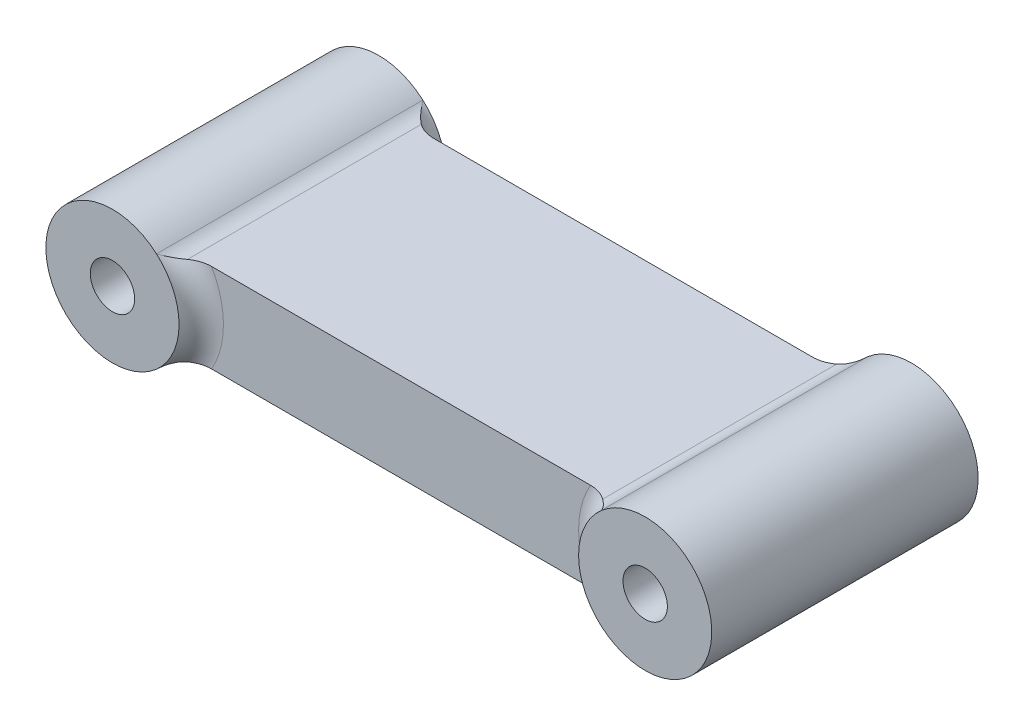
ISO-10303-21;
HEADER;
FILE_DESCRIPTION(('STEP AP214'),'2;1');
FILE_NAME('part.step','',(''),(''),'','','');
FILE_SCHEMA(('AUTOMOTIVE_DESIGN { 1 0 10303 214 1 1 1 1 }'));
ENDSEC;
DATA;
#1=APPLICATION_CONTEXT('core data for automotive mechanical design processes');
#2=APPLICATION_PROTOCOL_DEFINITION('international standard','automotive_design',2000,#1);
#3=PRODUCT_CONTEXT('',#1,'mechanical');
#4=PRODUCT('Part','Part','',(#3));
#5=PRODUCT_RELATED_PRODUCT_CATEGORY('part','',(#4));
#6=PRODUCT_DEFINITION_FORMATION('','',#4);
#7=PRODUCT_DEFINITION_CONTEXT('part definition',#1,'design');
#8=PRODUCT_DEFINITION('design','',#6,#7);
#9=PRODUCT_DEFINITION_SHAPE('','',#8);
#10=(LENGTH_UNIT() NAMED_UNIT(*) SI_UNIT(.MILLI.,.METRE.));
#11=(NAMED_UNIT(*) PLANE_ANGLE_UNIT() SI_UNIT($,.RADIAN.));
#12=(NAMED_UNIT(*) SI_UNIT($,.STERADIAN.) SOLID_ANGLE_UNIT());
#13=UNCERTAINTY_MEASURE_WITH_UNIT(LENGTH_MEASURE(1.E-05),#10,'distance_accuracy_value','');
#14=(GEOMETRIC_REPRESENTATION_CONTEXT(3) GLOBAL_UNCERTAINTY_ASSIGNED_CONTEXT((#13)) GLOBAL_UNIT_ASSIGNED_CONTEXT((#10,
#11,#12)) REPRESENTATION_CONTEXT('',''));
#15=CARTESIAN_POINT('',(0.,0.,0.));
#16=DIRECTION('',(0.,0.,1.));
#17=DIRECTION('',(1.,0.,0.));
#18=AXIS2_PLACEMENT_3D('',#15,#16,#17);
#19=CARTESIAN_POINT('',(23.,-2.,5.));
#20=DIRECTION('',(0.,1.,0.));
#21=DIRECTION('',(0.,0.,1.));
#22=AXIS2_PLACEMENT_3D('',#19,#20,#21);
#23=PLANE('',#22);
#24=DIRECTION('',(1.,0.,0.));
#25=VECTOR('',#24,1.);
#26=CARTESIAN_POINT('',(23.,-2.,-5.));
#27=LINE('',#26,#25);
#28=CARTESIAN_POINT('',(3.46410161513775,-2.,-5.));
#29=VERTEX_POINT('',#28);
#30=CARTESIAN_POINT('',(20.5358983848623,-2.,-5.));
#31=VERTEX_POINT('',#30);
#32=EDGE_CURVE('E162',#29,#31,#27,.T.);
#33=ORIENTED_EDGE('',*,*,#32,.T.);
#34=CARTESIAN_POINT('',(20.5358983848623,-2.,-5.));
#35=CARTESIAN_POINT('',(20.6224491273589,-2.,-5.00000546800803));
#36=CARTESIAN_POINT('',(20.7089389296264,-2.,-5.00842702045414));
#37=CARTESIAN_POINT('',(20.876455217603,-2.,-5.04066814521653));
#38=CARTESIAN_POINT('',(20.9575671155496,-2.,-5.06404323747672));
#39=CARTESIAN_POINT('',(21.0919763731926,-2.,-5.11623692688967));
#40=CARTESIAN_POINT('',(21.1466292215736,-2.,-5.14162250615181));
#41=CARTESIAN_POINT('',(21.2531753944758,-2.,-5.20002912144058));
#42=CARTESIAN_POINT('',(21.3049871669762,-2.,-5.23319865643572));
#43=CARTESIAN_POINT('',(21.3542486889354,-2.,-5.26993265869291));
#44=B_SPLINE_CURVE_WITH_KNOTS('',3,(#34,#35,#36,#37,#38,#39,#40,#41,#42,#43),.UNSPECIFIED.,.F.,
.F.,(4,2,2,2,4),(0.,0.259193483634548,0.511019606520545,0.69130396172624,0.875356440862325),.UNSPECIFIED.);
#45=CARTESIAN_POINT('',(21.3542486889354,-2.,-5.26993265869291));
#46=VERTEX_POINT('',#45);
#47=EDGE_CURVE('E311',#31,#46,#44,.T.);
#48=ORIENTED_EDGE('',*,*,#47,.T.);
#49=DIRECTION('',(0.,0.,1.));
#50=VECTOR('',#49,1.);
#51=CARTESIAN_POINT('',(21.3542486889354,-2.,5.));
#52=LINE('',#51,#50);
#53=CARTESIAN_POINT('',(21.3542486889354,-2.,5.26993265869291));
#54=VERTEX_POINT('',#53);
#55=EDGE_CURVE('E195',#46,#54,#52,.T.);
#56=ORIENTED_EDGE('',*,*,#55,.T.);
#57=CARTESIAN_POINT('',(21.3542486889354,-2.,5.26993265869291));
#58=CARTESIAN_POINT('',(21.3195104777886,-2.,5.24401132146456));
#59=CARTESIAN_POINT('',(21.2834971833119,-2.,5.2198749810097));
#60=CARTESIAN_POINT('',(21.2093014088683,-2.,5.17522551429657));
#61=CARTESIAN_POINT('',(21.1711195347141,-2.,5.15471138265658));
#62=CARTESIAN_POINT('',(21.0561591308194,-2.,5.09975997145693));
#63=CARTESIAN_POINT('',(20.976878090308,-2.,5.07039153665916));
#64=CARTESIAN_POINT('',(20.8377024129543,-2.,5.03261806093048));
#65=CARTESIAN_POINT('',(20.7787429213188,-2.,5.0206205481441));
#66=CARTESIAN_POINT('',(20.6585290915753,-2.,5.00423581430545));
#67=CARTESIAN_POINT('',(20.5972525292827,-2.,5.00001209782037));
#68=CARTESIAN_POINT('',(20.5358983848623,-2.,5.));
#69=B_SPLINE_CURVE_WITH_KNOTS('',3,(#57,#58,#59,#60,#61,#62,#63,#64,#65,#66,#67,#68),
.UNSPECIFIED.,.F.,.F.,(4,2,2,2,2,4),(0.,0.129893289692775,0.25975046928371,0.511832988699556,
0.69187057715927,0.875653389153103),.UNSPECIFIED.);
#70=CARTESIAN_POINT('',(20.5358983848623,-2.,5.));
#71=VERTEX_POINT('',#70);
#72=EDGE_CURVE('E310',#54,#71,#69,.T.);
#73=ORIENTED_EDGE('',*,*,#72,.T.);
#74=DIRECTION('',(1.,0.,0.));
#75=VECTOR('',#74,1.);
#76=CARTESIAN_POINT('',(23.,-2.,5.));
#77=LINE('',#76,#75);
#78=CARTESIAN_POINT('',(3.46410161513775,-2.,5.));
#79=VERTEX_POINT('',#78);
#80=EDGE_CURVE('E171',#79,#71,#77,.T.);
#81=ORIENTED_EDGE('',*,*,#80,.F.);
#82=CARTESIAN_POINT('',(3.46410161513775,-2.,5.));
#83=CARTESIAN_POINT('',(3.3775508726411,-2.,5.00000546800803));
#84=CARTESIAN_POINT('',(3.2910610703736,-2.,5.00842702045414));
#85=CARTESIAN_POINT('',(3.12354478239697,-2.,5.04066814521653));
#86=CARTESIAN_POINT('',(3.04243288445038,-2.,5.06404323747671));
#87=CARTESIAN_POINT('',(2.90802362680743,-2.,5.11623692688967));
#88=CARTESIAN_POINT('',(2.85337077842639,-2.,5.14162250615181));
#89=CARTESIAN_POINT('',(2.74682460552416,-2.,5.20002912144058));
#90=CARTESIAN_POINT('',(2.69501283302383,-2.,5.23319865643571));
#91=CARTESIAN_POINT('',(2.64575131106459,-2.,5.26993265869291));
#92=B_SPLINE_CURVE_WITH_KNOTS('',3,(#82,#83,#84,#85,#86,#87,#88,#89,#90,#91),.UNSPECIFIED.,.F.,
.F.,(4,2,2,2,4),(0.,0.259193483634546,0.511019606520545,0.691303961726233,0.875356440862324),.UNSPECIFIED.);
#93=CARTESIAN_POINT('',(2.64575131106459,-2.,5.26993265869291));
#94=VERTEX_POINT('',#93);
#95=EDGE_CURVE('E49',#79,#94,#92,.T.);
#96=ORIENTED_EDGE('',*,*,#95,.T.);
#97=DIRECTION('',(0.,0.,1.));
#98=VECTOR('',#97,1.);
#99=CARTESIAN_POINT('',(2.64575131106459,-2.,-5.));
#100=LINE('',#99,#98);
#101=CARTESIAN_POINT('',(2.64575131106459,-2.,-5.26993265869291));
#102=VERTEX_POINT('',#101);
#103=EDGE_CURVE('E193',#94,#102,#100,.F.);
#104=ORIENTED_EDGE('',*,*,#103,.T.);
#105=CARTESIAN_POINT('',(2.64575131106459,-2.,-5.26993265869291));
#106=CARTESIAN_POINT('',(2.68048952221139,-2.,-5.24401132146456));
#107=CARTESIAN_POINT('',(2.71650281668806,-2.,-5.2198749810097));
#108=CARTESIAN_POINT('',(2.79069859113175,-2.,-5.17522551429657));
#109=CARTESIAN_POINT('',(2.82888046528587,-2.,-5.15471138265658));
#110=CARTESIAN_POINT('',(2.94384086918057,-2.,-5.09975997145693));
#111=CARTESIAN_POINT('',(3.02312190969201,-2.,-5.07039153665916));
#112=CARTESIAN_POINT('',(3.16229758704567,-2.,-5.03261806093048));
#113=CARTESIAN_POINT('',(3.22125707868117,-2.,-5.0206205481441));
#114=CARTESIAN_POINT('',(3.34147090842471,-2.,-5.00423581430545));
#115=CARTESIAN_POINT('',(3.40274747071726,-2.,-5.00001209782038));
#116=CARTESIAN_POINT('',(3.46410161513775,-2.,-5.));
#117=B_SPLINE_CURVE_WITH_KNOTS('',3,(#105,#106,#107,#108,#109,#110,#111,#112,#113,#114,#115,
#116),.UNSPECIFIED.,.F.,.F.,(4,2,2,2,2,4),(0.,0.129893289692774,0.259750469283706,
0.511832988699554,0.691870577159268,0.875653389153102),.UNSPECIFIED.);
#118=EDGE_CURVE('E213',#102,#29,#117,.T.);
#119=ORIENTED_EDGE('',*,*,#118,.T.);
#120=EDGE_LOOP('',(#33,#48,#56,#73,#81,#96,#104,#119));
#121=FACE_BOUND('',#120,.T.);
#122=ADVANCED_FACE('F35',(#121),#23,.F.);
#123=CARTESIAN_POINT('',(2.23606797749979,2.,5.));
#124=DIRECTION('',(0.,-1.,0.));
#125=DIRECTION('',(0.,0.,-1.));
#126=AXIS2_PLACEMENT_3D('',#123,#124,#125);
#127=PLANE('',#126);
#128=CARTESIAN_POINT('',(3.46410161513775,2.,-5.));
#129=CARTESIAN_POINT('',(3.3775508726411,2.,-5.00000546800803));
#130=CARTESIAN_POINT('',(3.2910610703736,2.,-5.00842702045414));
#131=CARTESIAN_POINT('',(3.12354478239697,2.,-5.04066814521653));
#132=CARTESIAN_POINT('',(3.04243288445038,2.,-5.06404323747671));
#133=CARTESIAN_POINT('',(2.90802362680743,2.,-5.11623692688967));
#134=CARTESIAN_POINT('',(2.85337077842639,2.,-5.14162250615181));
#135=CARTESIAN_POINT('',(2.74682460552416,2.,-5.20002912144058));
#136=CARTESIAN_POINT('',(2.69501283302383,2.,-5.23319865643571));
#137=CARTESIAN_POINT('',(2.64575131106459,2.,-5.26993265869291));
#138=B_SPLINE_CURVE_WITH_KNOTS('',3,(#128,#129,#130,#131,#132,#133,#134,#135,#136,#137),
.UNSPECIFIED.,.F.,.F.,(4,2,2,2,4),(0.,0.259193483634546,0.511019606520545,0.691303961726233,
0.875356440862324),.UNSPECIFIED.);
#139=CARTESIAN_POINT('',(3.46410161513775,2.,-5.));
#140=VERTEX_POINT('',#139);
#141=CARTESIAN_POINT('',(2.64575131106459,2.,-5.26993265869291));
#142=VERTEX_POINT('',#141);
#143=EDGE_CURVE('E221',#140,#142,#138,.T.);
#144=ORIENTED_EDGE('',*,*,#143,.T.);
#145=DIRECTION('',(0.,0.,1.));
#146=VECTOR('',#145,1.);
#147=CARTESIAN_POINT('',(2.64575131106459,2.,5.));
#148=LINE('',#147,#146);
#149=CARTESIAN_POINT('',(2.64575131106459,2.,5.26993265869291));
#150=VERTEX_POINT('',#149);
#151=EDGE_CURVE('E207',#142,#150,#148,.T.);
#152=ORIENTED_EDGE('',*,*,#151,.T.);
#153=CARTESIAN_POINT('',(2.64575131106459,2.,5.26993265869291));
#154=CARTESIAN_POINT('',(2.68048952221139,2.,5.24401132146456));
#155=CARTESIAN_POINT('',(2.71650281668806,2.,5.2198749810097));
#156=CARTESIAN_POINT('',(2.79069859113175,2.,5.17522551429657));
#157=CARTESIAN_POINT('',(2.82888046528587,2.,5.15471138265658));
#158=CARTESIAN_POINT('',(2.94384086918057,2.,5.09975997145693));
#159=CARTESIAN_POINT('',(3.02312190969201,2.,5.07039153665916));
#160=CARTESIAN_POINT('',(3.16229758704567,2.,5.03261806093048));
#161=CARTESIAN_POINT('',(3.22125707868117,2.,5.0206205481441));
#162=CARTESIAN_POINT('',(3.34147090842471,2.,5.00423581430545));
#163=CARTESIAN_POINT('',(3.40274747071726,2.,5.00001209782038));
#164=CARTESIAN_POINT('',(3.46410161513776,2.,5.));
#165=B_SPLINE_CURVE_WITH_KNOTS('',3,(#153,#154,#155,#156,#157,#158,#159,#160,#161,#162,#163,
#164),.UNSPECIFIED.,.F.,.F.,(4,2,2,2,2,4),(0.,0.129893289692774,0.259750469283706,
0.511832988699554,0.691870577159268,0.875653389153103),.UNSPECIFIED.);
#166=CARTESIAN_POINT('',(3.46410161513776,2.,5.));
#167=VERTEX_POINT('',#166);
#168=EDGE_CURVE('E11',#150,#167,#165,.T.);
#169=ORIENTED_EDGE('',*,*,#168,.T.);
#170=DIRECTION('',(-1.,0.,0.));
#171=VECTOR('',#170,1.);
#172=CARTESIAN_POINT('',(2.23606797749979,2.,5.));
#173=LINE('',#172,#171);
#174=CARTESIAN_POINT('',(20.5358983848623,2.,5.));
#175=VERTEX_POINT('',#174);
#176=EDGE_CURVE('E174',#175,#167,#173,.T.);
#177=ORIENTED_EDGE('',*,*,#176,.F.);
#178=CARTESIAN_POINT('',(20.5358983848623,2.,5.));
#179=CARTESIAN_POINT('',(20.6224491273589,2.,5.00000546800803));
#180=CARTESIAN_POINT('',(20.7089389296264,2.,5.00842702045414));
#181=CARTESIAN_POINT('',(20.876455217603,2.,5.04066814521653));
#182=CARTESIAN_POINT('',(20.9575671155496,2.,5.06404323747672));
#183=CARTESIAN_POINT('',(21.0919763731926,2.,5.11623692688967));
#184=CARTESIAN_POINT('',(21.1466292215736,2.,5.14162250615181));
#185=CARTESIAN_POINT('',(21.2531753944758,2.,5.20002912144058));
#186=CARTESIAN_POINT('',(21.3049871669762,2.,5.23319865643572));
#187=CARTESIAN_POINT('',(21.3542486889354,2.,5.26993265869291));
#188=B_SPLINE_CURVE_WITH_KNOTS('',3,(#178,#179,#180,#181,#182,#183,#184,#185,#186,#187),
.UNSPECIFIED.,.F.,.F.,(4,2,2,2,4),(0.,0.259193483634548,0.511019606520545,0.69130396172624,
0.875356440862325),.UNSPECIFIED.);
#189=CARTESIAN_POINT('',(21.3542486889354,2.,5.26993265869291));
#190=VERTEX_POINT('',#189);
#191=EDGE_CURVE('E275',#175,#190,#188,.T.);
#192=ORIENTED_EDGE('',*,*,#191,.T.);
#193=DIRECTION('',(0.,0.,1.));
#194=VECTOR('',#193,1.);
#195=CARTESIAN_POINT('',(21.3542486889354,2.,-5.));
#196=LINE('',#195,#194);
#197=CARTESIAN_POINT('',(21.3542486889354,2.,-5.26993265869291));
#198=VERTEX_POINT('',#197);
#199=EDGE_CURVE('E57',#190,#198,#196,.F.);
#200=ORIENTED_EDGE('',*,*,#199,.T.);
#201=CARTESIAN_POINT('',(21.3542486889354,2.,-5.26993265869291));
#202=CARTESIAN_POINT('',(21.3195104777886,2.,-5.24401132146456));
#203=CARTESIAN_POINT('',(21.2834971833119,2.,-5.2198749810097));
#204=CARTESIAN_POINT('',(21.2093014088683,2.,-5.17522551429657));
#205=CARTESIAN_POINT('',(21.1711195347141,2.,-5.15471138265658));
#206=CARTESIAN_POINT('',(21.0561591308194,2.,-5.09975997145693));
#207=CARTESIAN_POINT('',(20.976878090308,2.,-5.07039153665916));
#208=CARTESIAN_POINT('',(20.8377024129543,2.,-5.03261806093048));
#209=CARTESIAN_POINT('',(20.7787429213188,2.,-5.0206205481441));
#210=CARTESIAN_POINT('',(20.6585290915753,2.,-5.00423581430545));
#211=CARTESIAN_POINT('',(20.5972525292827,2.,-5.00001209782037));
#212=CARTESIAN_POINT('',(20.5358983848623,2.,-5.));
#213=B_SPLINE_CURVE_WITH_KNOTS('',3,(#201,#202,#203,#204,#205,#206,#207,#208,#209,#210,#211,
#212),.UNSPECIFIED.,.F.,.F.,(4,2,2,2,2,4),(0.,0.129893289692775,0.25975046928371,
0.511832988699556,0.69187057715927,0.875653389153103),.UNSPECIFIED.);
#214=CARTESIAN_POINT('',(20.5358983848623,2.,-5.));
#215=VERTEX_POINT('',#214);
#216=EDGE_CURVE('E305',#198,#215,#213,.T.);
#217=ORIENTED_EDGE('',*,*,#216,.T.);
#218=DIRECTION('',(-1.,0.,0.));
#219=VECTOR('',#218,1.);
#220=CARTESIAN_POINT('',(2.23606797749979,2.,-5.));
#221=LINE('',#220,#219);
#222=EDGE_CURVE('E164',#215,#140,#221,.T.);
#223=ORIENTED_EDGE('',*,*,#222,.T.);
#224=EDGE_LOOP('',(#144,#152,#169,#177,#192,#200,#217,#223));
#225=FACE_BOUND('',#224,.T.);
#226=ADVANCED_FACE('F294',(#225),#127,.F.);
#227=CARTESIAN_POINT('',(0.,0.,6.));
#228=DIRECTION('',(0.,0.,-1.));
#229=DIRECTION('',(-1.,0.,0.));
#230=AXIS2_PLACEMENT_3D('',#227,#228,#229);
#231=CYLINDRICAL_SURFACE('',#230,3.);
#232=CARTESIAN_POINT('',(0.,0.,-6.));
#233=DIRECTION('',(0.,0.,1.));
#234=DIRECTION('',(1.,0.,0.));
#235=AXIS2_PLACEMENT_3D('',#232,#233,#234);
#236=CIRCLE('',#235,3.);
#237=CARTESIAN_POINT('',(1.98431348329844,2.25,-6.));
#238=VERTEX_POINT('',#237);
#239=CARTESIAN_POINT('',(1.98431348329844,-2.25,-6.));
#240=VERTEX_POINT('',#239);
#241=EDGE_CURVE('E189',#238,#240,#236,.T.);
#242=ORIENTED_EDGE('',*,*,#241,.T.);
#243=DIRECTION('',(0.,0.,-1.));
#244=VECTOR('',#243,1.);
#245=CARTESIAN_POINT('',(1.98431348329844,-2.25,6.));
#246=LINE('',#245,#244);
#247=CARTESIAN_POINT('',(1.98431348329844,-2.25,6.));
#248=VERTEX_POINT('',#247);
#249=EDGE_CURVE('E199',#240,#248,#246,.F.);
#250=ORIENTED_EDGE('',*,*,#249,.T.);
#251=CARTESIAN_POINT('',(0.,0.,6.));
#252=DIRECTION('',(0.,0.,1.));
#253=DIRECTION('',(1.,0.,0.));
#254=AXIS2_PLACEMENT_3D('',#251,#252,#253);
#255=CIRCLE('',#254,3.);
#256=CARTESIAN_POINT('',(1.98431348329844,2.25,6.));
#257=VERTEX_POINT('',#256);
#258=EDGE_CURVE('E138',#257,#248,#255,.T.);
#259=ORIENTED_EDGE('',*,*,#258,.F.);
#260=DIRECTION('',(0.,0.,-1.));
#261=VECTOR('',#260,1.);
#262=CARTESIAN_POINT('',(1.98431348329844,2.25,6.));
#263=LINE('',#262,#261);
#264=EDGE_CURVE('E197',#257,#238,#263,.T.);
#265=ORIENTED_EDGE('',*,*,#264,.T.);
#266=EDGE_LOOP('',(#242,#250,#259,#265));
#267=FACE_BOUND('',#266,.T.);
#268=ADVANCED_FACE('F298',(#267),#231,.T.);
#269=CARTESIAN_POINT('',(0.,0.,6.));
#270=DIRECTION('',(0.,0.,1.));
#271=DIRECTION('',(1.,0.,0.));
#272=AXIS2_PLACEMENT_3D('',#269,#270,#271);
#273=PLANE('',#272);
#274=ORIENTED_EDGE('',*,*,#258,.T.);
#275=EDGE_CURVE('E188',#248,#257,#255,.T.);
#276=ORIENTED_EDGE('',*,*,#275,.T.);
#277=EDGE_LOOP('',(#274,#276));
#278=FACE_BOUND('',#277,.T.);
#279=CARTESIAN_POINT('',(0.,0.,6.));
#280=DIRECTION('',(0.,0.,1.));
#281=DIRECTION('',(1.,0.,0.));
#282=AXIS2_PLACEMENT_3D('',#279,#280,#281);
#283=CIRCLE('',#282,1.);
#284=CARTESIAN_POINT('',(1.,0.,6.));
#285=VERTEX_POINT('',#284);
#286=EDGE_CURVE('E180',#285,#285,#283,.T.);
#287=ORIENTED_EDGE('',*,*,#286,.F.);
#288=EDGE_LOOP('',(#287));
#289=FACE_BOUND('',#288,.T.);
#290=ADVANCED_FACE('F371',(#278,#289),#273,.T.);
#291=CARTESIAN_POINT('',(0.,0.,-6.));
#292=DIRECTION('',(0.,0.,1.));
#293=DIRECTION('',(1.,0.,0.));
#294=AXIS2_PLACEMENT_3D('',#291,#292,#293);
#295=PLANE('',#294);
#296=ORIENTED_EDGE('',*,*,#241,.F.);
#297=EDGE_CURVE('E183',#240,#238,#236,.T.);
#298=ORIENTED_EDGE('',*,*,#297,.F.);
#299=EDGE_LOOP('',(#296,#298));
#300=FACE_BOUND('',#299,.T.);
#301=CARTESIAN_POINT('',(0.,0.,-6.));
#302=DIRECTION('',(0.,0.,1.));
#303=DIRECTION('',(1.,0.,0.));
#304=AXIS2_PLACEMENT_3D('',#301,#302,#303);
#305=CIRCLE('',#304,1.);
#306=CARTESIAN_POINT('',(1.,0.,-6.));
#307=VERTEX_POINT('',#306);
#308=EDGE_CURVE('E176',#307,#307,#305,.T.);
#309=ORIENTED_EDGE('',*,*,#308,.T.);
#310=EDGE_LOOP('',(#309));
#311=FACE_BOUND('',#310,.T.);
#312=ADVANCED_FACE('F362',(#300,#311),#295,.F.);
#313=CARTESIAN_POINT('',(0.,0.,6.));
#314=DIRECTION('',(0.,0.,-1.));
#315=DIRECTION('',(-1.,0.,0.));
#316=AXIS2_PLACEMENT_3D('',#313,#314,#315);
#317=CYLINDRICAL_SURFACE('',#316,1.);
#318=ORIENTED_EDGE('',*,*,#286,.T.);
#319=EDGE_LOOP('',(#318));
#320=FACE_BOUND('',#319,.T.);
#321=ORIENTED_EDGE('',*,*,#308,.F.);
#322=EDGE_LOOP('',(#321));
#323=FACE_BOUND('',#322,.T.);
#324=ADVANCED_FACE('F377',(#320,#323),#317,.F.);
#325=CARTESIAN_POINT('',(0.,0.,5.));
#326=DIRECTION('',(0.,0.,-1.));
#327=DIRECTION('',(-1.,0.,0.));
#328=AXIS2_PLACEMENT_3D('',#325,#326,#327);
#329=PLANE('',#328);
#330=ORIENTED_EDGE('',*,*,#80,.T.);
#331=CARTESIAN_POINT('',(24.,0.,5.));
#332=DIRECTION('',(0.,0.,-1.));
#333=DIRECTION('',(-1.,0.,0.));
#334=AXIS2_PLACEMENT_3D('',#331,#332,#333);
#335=CIRCLE('',#334,3.99999999999999);
#336=EDGE_CURVE('E211',#71,#175,#335,.T.);
#337=ORIENTED_EDGE('',*,*,#336,.T.);
#338=ORIENTED_EDGE('',*,*,#176,.T.);
#339=CARTESIAN_POINT('',(0.,0.,5.));
#340=DIRECTION('',(0.,0.,-1.));
#341=DIRECTION('',(-1.,0.,0.));
#342=AXIS2_PLACEMENT_3D('',#339,#340,#341);
#343=CIRCLE('',#342,4.);
#344=EDGE_CURVE('E209',#167,#79,#343,.T.);
#345=ORIENTED_EDGE('',*,*,#344,.T.);
#346=EDGE_LOOP('',(#330,#337,#338,#345));
#347=FACE_BOUND('',#346,.T.);
#348=ADVANCED_FACE('F380',(#347),#329,.F.);
#349=CARTESIAN_POINT('',(0.,0.,-5.));
#350=DIRECTION('',(0.,0.,-1.));
#351=DIRECTION('',(-1.,0.,0.));
#352=AXIS2_PLACEMENT_3D('',#349,#350,#351);
#353=PLANE('',#352);
#354=ORIENTED_EDGE('',*,*,#32,.F.);
#355=CARTESIAN_POINT('',(0.,0.,-5.));
#356=DIRECTION('',(0.,0.,-1.));
#357=DIRECTION('',(-1.,0.,0.));
#358=AXIS2_PLACEMENT_3D('',#355,#356,#357);
#359=CIRCLE('',#358,4.);
#360=EDGE_CURVE('E204',#29,#140,#359,.F.);
#361=ORIENTED_EDGE('',*,*,#360,.T.);
#362=ORIENTED_EDGE('',*,*,#222,.F.);
#363=CARTESIAN_POINT('',(24.,0.,-5.));
#364=DIRECTION('',(0.,0.,-1.));
#365=DIRECTION('',(-1.,0.,0.));
#366=AXIS2_PLACEMENT_3D('',#363,#364,#365);
#367=CIRCLE('',#366,3.99999999999999);
#368=EDGE_CURVE('E202',#215,#31,#367,.F.);
#369=ORIENTED_EDGE('',*,*,#368,.T.);
#370=EDGE_LOOP('',(#354,#361,#362,#369));
#371=FACE_BOUND('',#370,.T.);
#372=ADVANCED_FACE('F299',(#371),#353,.T.);
#373=CARTESIAN_POINT('',(24.,0.,6.));
#374=DIRECTION('',(0.,0.,-1.));
#375=DIRECTION('',(-1.,0.,0.));
#376=AXIS2_PLACEMENT_3D('',#373,#374,#375);
#377=CYLINDRICAL_SURFACE('',#376,2.99999999999999);
#378=CARTESIAN_POINT('',(24.,0.,6.));
#379=DIRECTION('',(0.,0.,1.));
#380=DIRECTION('',(1.,0.,0.));
#381=AXIS2_PLACEMENT_3D('',#378,#379,#380);
#382=CIRCLE('',#381,2.99999999999999);
#383=CARTESIAN_POINT('',(22.0156865167016,-2.25,6.));
#384=VERTEX_POINT('',#383);
#385=CARTESIAN_POINT('',(22.0156865167016,2.25,6.));
#386=VERTEX_POINT('',#385);
#387=EDGE_CURVE('E131',#384,#386,#382,.T.);
#388=ORIENTED_EDGE('',*,*,#387,.F.);
#389=DIRECTION('',(0.,0.,-1.));
#390=VECTOR('',#389,1.);
#391=CARTESIAN_POINT('',(22.0156865167016,-2.25,6.));
#392=LINE('',#391,#390);
#393=CARTESIAN_POINT('',(22.0156865167016,-2.25,-6.));
#394=VERTEX_POINT('',#393);
#395=EDGE_CURVE('E137',#384,#394,#392,.T.);
#396=ORIENTED_EDGE('',*,*,#395,.T.);
#397=CARTESIAN_POINT('',(24.,0.,-6.));
#398=DIRECTION('',(0.,0.,1.));
#399=DIRECTION('',(1.,0.,0.));
#400=AXIS2_PLACEMENT_3D('',#397,#398,#399);
#401=CIRCLE('',#400,2.99999999999999);
#402=CARTESIAN_POINT('',(22.0156865167016,2.25,-6.));
#403=VERTEX_POINT('',#402);
#404=EDGE_CURVE('E134',#394,#403,#401,.T.);
#405=ORIENTED_EDGE('',*,*,#404,.T.);
#406=DIRECTION('',(0.,0.,-1.));
#407=VECTOR('',#406,1.);
#408=CARTESIAN_POINT('',(22.0156865167016,2.25,6.));
#409=LINE('',#408,#407);
#410=EDGE_CURVE('E127',#403,#386,#409,.F.);
#411=ORIENTED_EDGE('',*,*,#410,.T.);
#412=EDGE_LOOP('',(#388,#396,#405,#411));
#413=FACE_BOUND('',#412,.T.);
#414=ADVANCED_FACE('F129',(#413),#377,.T.);
#415=CARTESIAN_POINT('',(24.,0.,6.));
#416=DIRECTION('',(0.,0.,1.));
#417=DIRECTION('',(1.,0.,0.));
#418=AXIS2_PLACEMENT_3D('',#415,#416,#417);
#419=PLANE('',#418);
#420=EDGE_CURVE('E144',#386,#384,#382,.T.);
#421=ORIENTED_EDGE('',*,*,#420,.T.);
#422=ORIENTED_EDGE('',*,*,#387,.T.);
#423=EDGE_LOOP('',(#421,#422));
#424=FACE_BOUND('',#423,.T.);
#425=CARTESIAN_POINT('',(24.,0.,6.));
#426=DIRECTION('',(0.,0.,1.));
#427=DIRECTION('',(1.,0.,0.));
#428=AXIS2_PLACEMENT_3D('',#425,#426,#427);
#429=CIRCLE('',#428,1.);
#430=CARTESIAN_POINT('',(25.,0.,6.));
#431=VERTEX_POINT('',#430);
#432=EDGE_CURVE('E422',#431,#431,#429,.T.);
#433=ORIENTED_EDGE('',*,*,#432,.F.);
#434=EDGE_LOOP('',(#433));
#435=FACE_BOUND('',#434,.T.);
#436=ADVANCED_FACE('F141',(#424,#435),#419,.T.);
#437=CARTESIAN_POINT('',(24.,0.,-6.));
#438=DIRECTION('',(0.,0.,1.));
#439=DIRECTION('',(1.,0.,0.));
#440=AXIS2_PLACEMENT_3D('',#437,#438,#439);
#441=PLANE('',#440);
#442=EDGE_CURVE('E146',#403,#394,#401,.T.);
#443=ORIENTED_EDGE('',*,*,#442,.F.);
#444=ORIENTED_EDGE('',*,*,#404,.F.);
#445=EDGE_LOOP('',(#443,#444));
#446=FACE_BOUND('',#445,.T.);
#447=CARTESIAN_POINT('',(24.,0.,-6.));
#448=DIRECTION('',(0.,0.,1.));
#449=DIRECTION('',(1.,0.,0.));
#450=AXIS2_PLACEMENT_3D('',#447,#448,#449);
#451=CIRCLE('',#450,1.);
#452=CARTESIAN_POINT('',(25.,0.,-6.));
#453=VERTEX_POINT('',#452);
#454=EDGE_CURVE('E153',#453,#453,#451,.T.);
#455=ORIENTED_EDGE('',*,*,#454,.T.);
#456=EDGE_LOOP('',(#455));
#457=FACE_BOUND('',#456,.T.);
#458=ADVANCED_FACE('F407',(#446,#457),#441,.F.);
#459=CARTESIAN_POINT('',(24.,0.,6.));
#460=DIRECTION('',(0.,0.,-1.));
#461=DIRECTION('',(-1.,0.,0.));
#462=AXIS2_PLACEMENT_3D('',#459,#460,#461);
#463=CYLINDRICAL_SURFACE('',#462,1.);
#464=ORIENTED_EDGE('',*,*,#432,.T.);
#465=EDGE_LOOP('',(#464));
#466=FACE_BOUND('',#465,.T.);
#467=ORIENTED_EDGE('',*,*,#454,.F.);
#468=EDGE_LOOP('',(#467));
#469=FACE_BOUND('',#468,.T.);
#470=ADVANCED_FACE('F410',(#466,#469),#463,.F.);
#471=CARTESIAN_POINT('',(21.3542486889354,3.,6.));
#472=DIRECTION('',(0.,0.,-1.));
#473=DIRECTION('',(-1.,0.,0.));
#474=AXIS2_PLACEMENT_3D('',#471,#472,#473);
#475=CYLINDRICAL_SURFACE('',#474,1.);
#476=ORIENTED_EDGE('',*,*,#199,.F.);
#477=CARTESIAN_POINT('',(21.3542486889354,2.,5.26993265869291));
#478=CARTESIAN_POINT('',(21.3884508111177,2.00001486852622,5.29547807902821));
#479=CARTESIAN_POINT('',(21.421803990253,2.00175383368413,5.32207493668434));
#480=CARTESIAN_POINT('',(21.4867242359734,2.00827439817092,5.37690593916242));
#481=CARTESIAN_POINT('',(21.5182946000112,2.01305016565356,5.40513685171315));
#482=CARTESIAN_POINT('',(21.579554879525,2.02521463978259,5.46274228042587));
#483=CARTESIAN_POINT('',(21.60925257222,2.03259156714879,5.49211111848847));
#484=CARTESIAN_POINT('',(21.6669694848994,2.04967834544828,5.55182171664871));
#485=CARTESIAN_POINT('',(21.6949878089286,2.05938942807006,5.58216398305617));
#486=CARTESIAN_POINT('',(21.7770151455897,2.0918405575037,5.67474034622879));
#487=CARTESIAN_POINT('',(21.8285300551552,2.11779835211832,5.73807617799161));
#488=CARTESIAN_POINT('',(21.9252605916555,2.17710282821899,5.86602601956064));
#489=CARTESIAN_POINT('',(21.9704771453206,2.21044842080155,5.93063983972449));
#490=CARTESIAN_POINT('',(22.0136144371323,2.24817642774581,5.9968127504605));
#491=CARTESIAN_POINT('',(22.0146514261662,2.24908715779419,5.99840639085276));
#492=CARTESIAN_POINT('',(22.0156865167016,2.25,6.));
#493=B_SPLINE_CURVE_WITH_KNOTS('',3,(#477,#478,#479,#480,#481,#482,#483,#484,#485,#486,#487,
#488,#489,#490,#491,#492),.UNSPECIFIED.,.F.,.F.,(4,2,2,2,2,2,2,4),(0.,0.127937881177757,
0.255630810627468,0.382752759482392,0.509941935962646,0.766267129716277,1.02255456825052,
1.02887912937837),.UNSPECIFIED.);
#494=EDGE_CURVE('E149',#386,#190,#493,.F.);
#495=ORIENTED_EDGE('',*,*,#494,.F.);
#496=ORIENTED_EDGE('',*,*,#410,.F.);
#497=CARTESIAN_POINT('',(21.3542486889354,2.,-5.26993265869291));
#498=CARTESIAN_POINT('',(21.3884508111177,2.00001486852622,-5.29547807902821));
#499=CARTESIAN_POINT('',(21.4218039902531,2.00175383368413,-5.32207493668434));
#500=CARTESIAN_POINT('',(21.4867242359734,2.00827439817092,-5.37690593916243));
#501=CARTESIAN_POINT('',(21.5182946000112,2.01305016565357,-5.40513685171316));
#502=CARTESIAN_POINT('',(21.5795548795251,2.0252146397826,-5.46274228042588));
#503=CARTESIAN_POINT('',(21.60925257222,2.03259156714879,-5.49211111848848));
#504=CARTESIAN_POINT('',(21.6669694848994,2.04967834544828,-5.55182171664872));
#505=CARTESIAN_POINT('',(21.6949878089286,2.05938942807005,-5.58216398305617));
#506=CARTESIAN_POINT('',(21.7770151455897,2.09184055750371,-5.67474034622877));
#507=CARTESIAN_POINT('',(21.8285300551553,2.11779835211837,-5.73807617799153));
#508=CARTESIAN_POINT('',(21.9252605916554,2.17710282821894,-5.86602601956071));
#509=CARTESIAN_POINT('',(21.9704771453203,2.21044842080135,-5.93063983972477));
#510=CARTESIAN_POINT('',(22.0136144371322,2.2481764277458,-5.99681275046051));
#511=CARTESIAN_POINT('',(22.0146514261662,2.24908715779418,-5.99840639085277));
#512=CARTESIAN_POINT('',(22.0156865167016,2.25,-6.));
#513=B_SPLINE_CURVE_WITH_KNOTS('',3,(#497,#498,#499,#500,#501,#502,#503,#504,#505,#506,#507,
#508,#509,#510,#511,#512),.UNSPECIFIED.,.F.,.F.,(4,2,2,2,2,2,2,4),(0.,0.127937881177771,
0.255630810627492,0.382752759482406,0.509941935962646,0.76626712971627,1.02255456825052,
1.02887912937837),.UNSPECIFIED.);
#514=EDGE_CURVE('E154',#198,#403,#513,.T.);
#515=ORIENTED_EDGE('',*,*,#514,.F.);
#516=EDGE_LOOP('',(#476,#495,#496,#515));
#517=FACE_BOUND('',#516,.T.);
#518=ADVANCED_FACE('F150',(#517),#475,.F.);
#519=CARTESIAN_POINT('',(24.,0.,6.));
#520=DIRECTION('',(0.,0.,-1.));
#521=DIRECTION('',(-1.,0.,0.));
#522=AXIS2_PLACEMENT_3D('',#519,#520,#521);
#523=TOROIDAL_SURFACE('',#522,3.99999999999999,1.);
#524=ORIENTED_EDGE('',*,*,#336,.F.);
#525=ORIENTED_EDGE('',*,*,#72,.F.);
#526=CARTESIAN_POINT('',(21.3542486889354,-2.,5.26993265869291));
#527=CARTESIAN_POINT('',(21.3884508111177,-2.00001486852622,5.29547807902821));
#528=CARTESIAN_POINT('',(21.421803990253,-2.00175383368413,5.32207493668434));
#529=CARTESIAN_POINT('',(21.4867242359734,-2.00827439817092,5.37690593916242));
#530=CARTESIAN_POINT('',(21.5182946000112,-2.01305016565356,5.40513685171315));
#531=CARTESIAN_POINT('',(21.579554879525,-2.02521463978259,5.46274228042587));
#532=CARTESIAN_POINT('',(21.60925257222,-2.03259156714879,5.49211111848847));
#533=CARTESIAN_POINT('',(21.6669694848994,-2.04967834544828,5.55182171664871));
#534=CARTESIAN_POINT('',(21.6949878089286,-2.05938942807006,5.58216398305617));
#535=CARTESIAN_POINT('',(21.7770151455897,-2.0918405575037,5.67474034622879));
#536=CARTESIAN_POINT('',(21.8285300551552,-2.11779835211832,5.73807617799161));
#537=CARTESIAN_POINT('',(21.9252605916555,-2.17710282821899,5.86602601956064));
#538=CARTESIAN_POINT('',(21.9704771453206,-2.21044842080155,5.93063983972449));
#539=CARTESIAN_POINT('',(22.0136144371323,-2.24817642774581,5.9968127504605));
#540=CARTESIAN_POINT('',(22.0146514261662,-2.24908715779419,5.99840639085276));
#541=CARTESIAN_POINT('',(22.0156865167016,-2.25,6.));
#542=B_SPLINE_CURVE_WITH_KNOTS('',3,(#526,#527,#528,#529,#530,#531,#532,#533,#534,#535,#536,
#537,#538,#539,#540,#541),.UNSPECIFIED.,.F.,.F.,(4,2,2,2,2,2,2,4),(0.,0.127937881177757,
0.255630810627468,0.382752759482392,0.509941935962646,0.766267129716277,1.02255456825052,
1.02887912937837),.UNSPECIFIED.);
#543=EDGE_CURVE('E160',#384,#54,#542,.F.);
#544=ORIENTED_EDGE('',*,*,#543,.F.);
#545=ORIENTED_EDGE('',*,*,#420,.F.);
#546=ORIENTED_EDGE('',*,*,#494,.T.);
#547=ORIENTED_EDGE('',*,*,#191,.F.);
#548=EDGE_LOOP('',(#524,#525,#544,#545,#546,#547));
#549=FACE_BOUND('',#548,.T.);
#550=ADVANCED_FACE('F157',(#549),#523,.F.);
#551=CARTESIAN_POINT('',(24.,0.,-6.));
#552=DIRECTION('',(0.,0.,-1.));
#553=DIRECTION('',(-1.,0.,0.));
#554=AXIS2_PLACEMENT_3D('',#551,#552,#553);
#555=TOROIDAL_SURFACE('',#554,3.99999999999999,1.);
#556=ORIENTED_EDGE('',*,*,#514,.T.);
#557=ORIENTED_EDGE('',*,*,#442,.T.);
#558=CARTESIAN_POINT('',(21.3542486889354,-2.,-5.26993265869291));
#559=CARTESIAN_POINT('',(21.3884508111177,-2.00001486852622,-5.29547807902821));
#560=CARTESIAN_POINT('',(21.421803990253,-2.00175383368413,-5.32207493668434));
#561=CARTESIAN_POINT('',(21.4867242359734,-2.00827439817092,-5.37690593916242));
#562=CARTESIAN_POINT('',(21.5182946000112,-2.01305016565356,-5.40513685171315));
#563=CARTESIAN_POINT('',(21.579554879525,-2.02521463978259,-5.46274228042587));
#564=CARTESIAN_POINT('',(21.60925257222,-2.03259156714879,-5.49211111848847));
#565=CARTESIAN_POINT('',(21.6669694848994,-2.04967834544828,-5.55182171664871));
#566=CARTESIAN_POINT('',(21.6949878089286,-2.05938942807006,-5.58216398305617));
#567=CARTESIAN_POINT('',(21.7770151455897,-2.0918405575037,-5.67474034622879));
#568=CARTESIAN_POINT('',(21.8285300551552,-2.11779835211832,-5.73807617799161));
#569=CARTESIAN_POINT('',(21.9252605916555,-2.17710282821899,-5.86602601956064));
#570=CARTESIAN_POINT('',(21.9704771453206,-2.21044842080155,-5.93063983972449));
#571=CARTESIAN_POINT('',(22.0136144371323,-2.24817642774581,-5.9968127504605));
#572=CARTESIAN_POINT('',(22.0146514261662,-2.24908715779419,-5.99840639085276));
#573=CARTESIAN_POINT('',(22.0156865167016,-2.25,-6.));
#574=B_SPLINE_CURVE_WITH_KNOTS('',3,(#558,#559,#560,#561,#562,#563,#564,#565,#566,#567,#568,
#569,#570,#571,#572,#573),.UNSPECIFIED.,.F.,.F.,(4,2,2,2,2,2,2,4),(0.,0.127937881177757,
0.255630810627468,0.382752759482392,0.509941935962646,0.766267129716277,1.02255456825052,
1.02887912937837),.UNSPECIFIED.);
#575=EDGE_CURVE('E286',#46,#394,#574,.T.);
#576=ORIENTED_EDGE('',*,*,#575,.F.);
#577=ORIENTED_EDGE('',*,*,#47,.F.);
#578=ORIENTED_EDGE('',*,*,#368,.F.);
#579=ORIENTED_EDGE('',*,*,#216,.F.);
#580=EDGE_LOOP('',(#556,#557,#576,#577,#578,#579));
#581=FACE_BOUND('',#580,.T.);
#582=ADVANCED_FACE('F320',(#581),#555,.F.);
#583=CARTESIAN_POINT('',(21.3542486889354,-3.,6.));
#584=DIRECTION('',(0.,0.,-1.));
#585=DIRECTION('',(-1.,0.,0.));
#586=AXIS2_PLACEMENT_3D('',#583,#584,#585);
#587=CYLINDRICAL_SURFACE('',#586,1.);
#588=ORIENTED_EDGE('',*,*,#543,.T.);
#589=ORIENTED_EDGE('',*,*,#55,.F.);
#590=ORIENTED_EDGE('',*,*,#575,.T.);
#591=ORIENTED_EDGE('',*,*,#395,.F.);
#592=EDGE_LOOP('',(#588,#589,#590,#591));
#593=FACE_BOUND('',#592,.T.);
#594=ADVANCED_FACE('F323',(#593),#587,.F.);
#595=CARTESIAN_POINT('',(2.64575131106459,3.,6.));
#596=DIRECTION('',(0.,0.,-1.));
#597=DIRECTION('',(-1.,0.,0.));
#598=AXIS2_PLACEMENT_3D('',#595,#596,#597);
#599=CYLINDRICAL_SURFACE('',#598,1.);
#600=CARTESIAN_POINT('',(2.64575131106459,2.,-5.26993265869291));
#601=CARTESIAN_POINT('',(2.61154918888229,2.00001486852623,-5.29547807902822));
#602=CARTESIAN_POINT('',(2.57819600974692,2.00175383368413,-5.32207493668437));
#603=CARTESIAN_POINT('',(2.51327576402651,2.00827439817093,-5.37690593916248));
#604=CARTESIAN_POINT('',(2.48170539998877,2.01305016565357,-5.40513685171322));
#605=CARTESIAN_POINT('',(2.4204451204749,2.02521463978261,-5.46274228042593));
#606=CARTESIAN_POINT('',(2.39074742777995,2.03259156714881,-5.49211111848851));
#607=CARTESIAN_POINT('',(2.33303051510058,2.04967834544828,-5.55182171664875));
#608=CARTESIAN_POINT('',(2.30501219107139,2.05938942807003,-5.58216398305622));
#609=CARTESIAN_POINT('',(2.22298485441027,2.09184055750377,-5.6747403462287));
#610=CARTESIAN_POINT('',(2.1714699448444,2.11779835211868,-5.73807617799112));
#611=CARTESIAN_POINT('',(2.07473940834493,2.17710282821862,-5.86602601956111));
#612=CARTESIAN_POINT('',(2.02952285468106,2.21044842080016,-5.93063983972634));
#613=CARTESIAN_POINT('',(1.98638556286783,2.24817642774575,-5.99681275046059));
#614=CARTESIAN_POINT('',(1.98534857383379,2.24908715779415,-5.99840639085281));
#615=CARTESIAN_POINT('',(1.98431348329844,2.25,-6.));
#616=B_SPLINE_CURVE_WITH_KNOTS('',3,(#600,#601,#602,#603,#604,#605,#606,#607,#608,#609,#610,
#611,#612,#613,#614,#615),.UNSPECIFIED.,.F.,.F.,(4,2,2,2,2,2,2,4),(0.,0.127937881177823,
0.255630810627591,0.38275275948245,0.509941935962648,0.766267129716261,1.02255456825052,
1.02887912937837),.UNSPECIFIED.);
#617=EDGE_CURVE('E251',#238,#142,#616,.F.);
#618=ORIENTED_EDGE('',*,*,#617,.F.);
#619=ORIENTED_EDGE('',*,*,#264,.F.);
#620=CARTESIAN_POINT('',(2.64575131106459,2.,5.26993265869291));
#621=CARTESIAN_POINT('',(2.61154918888229,2.00001486852623,5.29547807902822));
#622=CARTESIAN_POINT('',(2.57819600974692,2.00175383368413,5.32207493668437));
#623=CARTESIAN_POINT('',(2.51327576402651,2.00827439817093,5.37690593916248));
#624=CARTESIAN_POINT('',(2.48170539998877,2.01305016565357,5.40513685171322));
#625=CARTESIAN_POINT('',(2.4204451204749,2.02521463978261,5.46274228042593));
#626=CARTESIAN_POINT('',(2.39074742777995,2.03259156714881,5.49211111848851));
#627=CARTESIAN_POINT('',(2.33303051510058,2.04967834544828,5.55182171664875));
#628=CARTESIAN_POINT('',(2.30501219107139,2.05938942807003,5.58216398305622));
#629=CARTESIAN_POINT('',(2.22298485441027,2.09184055750377,5.6747403462287));
#630=CARTESIAN_POINT('',(2.1714699448444,2.11779835211868,5.73807617799112));
#631=CARTESIAN_POINT('',(2.07473940834493,2.17710282821862,5.86602601956111));
#632=CARTESIAN_POINT('',(2.02952285468106,2.21044842080016,5.93063983972634));
#633=CARTESIAN_POINT('',(1.98638556286783,2.24817642774575,5.99681275046059));
#634=CARTESIAN_POINT('',(1.98534857383379,2.24908715779415,5.99840639085281));
#635=CARTESIAN_POINT('',(1.98431348329844,2.25,6.));
#636=B_SPLINE_CURVE_WITH_KNOTS('',3,(#620,#621,#622,#623,#624,#625,#626,#627,#628,#629,#630,
#631,#632,#633,#634,#635),.UNSPECIFIED.,.F.,.F.,(4,2,2,2,2,2,2,4),(0.,0.127937881177823,
0.255630810627591,0.38275275948245,0.509941935962648,0.766267129716261,1.02255456825052,
1.02887912937837),.UNSPECIFIED.);
#637=EDGE_CURVE('E40',#150,#257,#636,.T.);
#638=ORIENTED_EDGE('',*,*,#637,.F.);
#639=ORIENTED_EDGE('',*,*,#151,.F.);
#640=EDGE_LOOP('',(#618,#619,#638,#639));
#641=FACE_BOUND('',#640,.T.);
#642=ADVANCED_FACE('F37',(#641),#599,.F.);
#643=CARTESIAN_POINT('',(0.,0.,6.));
#644=DIRECTION('',(0.,0.,-1.));
#645=DIRECTION('',(-1.,0.,0.));
#646=AXIS2_PLACEMENT_3D('',#643,#644,#645);
#647=TOROIDAL_SURFACE('',#646,4.,1.);
#648=ORIENTED_EDGE('',*,*,#637,.T.);
#649=ORIENTED_EDGE('',*,*,#275,.F.);
#650=CARTESIAN_POINT('',(2.64575131106459,-2.,5.26993265869291));
#651=CARTESIAN_POINT('',(2.61154918888229,-2.00001486852623,5.29547807902822));
#652=CARTESIAN_POINT('',(2.57819600974692,-2.00175383368413,5.32207493668437));
#653=CARTESIAN_POINT('',(2.51327576402651,-2.00827439817093,5.37690593916248));
#654=CARTESIAN_POINT('',(2.48170539998877,-2.01305016565357,5.40513685171322));
#655=CARTESIAN_POINT('',(2.4204451204749,-2.02521463978261,5.46274228042593));
#656=CARTESIAN_POINT('',(2.39074742777995,-2.03259156714881,5.49211111848851));
#657=CARTESIAN_POINT('',(2.33303051510058,-2.04967834544828,5.55182171664875));
#658=CARTESIAN_POINT('',(2.30501219107139,-2.05938942807003,5.58216398305622));
#659=CARTESIAN_POINT('',(2.22298485441027,-2.09184055750377,5.6747403462287));
#660=CARTESIAN_POINT('',(2.1714699448444,-2.11779835211868,5.73807617799112));
#661=CARTESIAN_POINT('',(2.07473940834493,-2.17710282821862,5.86602601956111));
#662=CARTESIAN_POINT('',(2.02952285468106,-2.21044842080016,5.93063983972634));
#663=CARTESIAN_POINT('',(1.98638556286783,-2.24817642774575,5.99681275046059));
#664=CARTESIAN_POINT('',(1.98534857383379,-2.24908715779415,5.99840639085281));
#665=CARTESIAN_POINT('',(1.98431348329844,-2.25,6.));
#666=B_SPLINE_CURVE_WITH_KNOTS('',3,(#650,#651,#652,#653,#654,#655,#656,#657,#658,#659,#660,
#661,#662,#663,#664,#665),.UNSPECIFIED.,.F.,.F.,(4,2,2,2,2,2,2,4),(0.,0.127937881177823,
0.255630810627591,0.38275275948245,0.509941935962648,0.766267129716261,1.02255456825052,
1.02887912937837),.UNSPECIFIED.);
#667=EDGE_CURVE('E257',#94,#248,#666,.T.);
#668=ORIENTED_EDGE('',*,*,#667,.F.);
#669=ORIENTED_EDGE('',*,*,#95,.F.);
#670=ORIENTED_EDGE('',*,*,#344,.F.);
#671=ORIENTED_EDGE('',*,*,#168,.F.);
#672=EDGE_LOOP('',(#648,#649,#668,#669,#670,#671));
#673=FACE_BOUND('',#672,.T.);
#674=ADVANCED_FACE('F236',(#673),#647,.F.);
#675=CARTESIAN_POINT('',(0.,0.,-6.));
#676=DIRECTION('',(0.,0.,-1.));
#677=DIRECTION('',(-1.,0.,0.));
#678=AXIS2_PLACEMENT_3D('',#675,#676,#677);
#679=TOROIDAL_SURFACE('',#678,4.,1.);
#680=ORIENTED_EDGE('',*,*,#360,.F.);
#681=ORIENTED_EDGE('',*,*,#118,.F.);
#682=CARTESIAN_POINT('',(2.64575131106459,-2.,-5.26993265869291));
#683=CARTESIAN_POINT('',(2.61154918888229,-2.00001486852623,-5.29547807902822));
#684=CARTESIAN_POINT('',(2.57819600974692,-2.00175383368413,-5.32207493668437));
#685=CARTESIAN_POINT('',(2.51327576402651,-2.00827439817093,-5.37690593916248));
#686=CARTESIAN_POINT('',(2.48170539998877,-2.01305016565357,-5.40513685171322));
#687=CARTESIAN_POINT('',(2.4204451204749,-2.02521463978261,-5.46274228042593));
#688=CARTESIAN_POINT('',(2.39074742777995,-2.03259156714881,-5.49211111848851));
#689=CARTESIAN_POINT('',(2.33303051510058,-2.04967834544828,-5.55182171664875));
#690=CARTESIAN_POINT('',(2.30501219107139,-2.05938942807003,-5.58216398305622));
#691=CARTESIAN_POINT('',(2.22298485441027,-2.09184055750377,-5.6747403462287));
#692=CARTESIAN_POINT('',(2.1714699448444,-2.11779835211868,-5.73807617799112));
#693=CARTESIAN_POINT('',(2.07473940834493,-2.17710282821862,-5.86602601956111));
#694=CARTESIAN_POINT('',(2.02952285468106,-2.21044842080016,-5.93063983972634));
#695=CARTESIAN_POINT('',(1.98638556286783,-2.24817642774575,-5.99681275046059));
#696=CARTESIAN_POINT('',(1.98534857383379,-2.24908715779415,-5.99840639085281));
#697=CARTESIAN_POINT('',(1.98431348329844,-2.25,-6.));
#698=B_SPLINE_CURVE_WITH_KNOTS('',3,(#682,#683,#684,#685,#686,#687,#688,#689,#690,#691,#692,
#693,#694,#695,#696,#697),.UNSPECIFIED.,.F.,.F.,(4,2,2,2,2,2,2,4),(0.,0.127937881177823,
0.255630810627591,0.38275275948245,0.509941935962648,0.766267129716261,1.02255456825052,
1.02887912937837),.UNSPECIFIED.);
#699=EDGE_CURVE('E244',#240,#102,#698,.F.);
#700=ORIENTED_EDGE('',*,*,#699,.F.);
#701=ORIENTED_EDGE('',*,*,#297,.T.);
#702=ORIENTED_EDGE('',*,*,#617,.T.);
#703=ORIENTED_EDGE('',*,*,#143,.F.);
#704=EDGE_LOOP('',(#680,#681,#700,#701,#702,#703));
#705=FACE_BOUND('',#704,.T.);
#706=ADVANCED_FACE('F230',(#705),#679,.F.);
#707=CARTESIAN_POINT('',(2.64575131106459,-3.,6.));
#708=DIRECTION('',(0.,0.,-1.));
#709=DIRECTION('',(-1.,0.,0.));
#710=AXIS2_PLACEMENT_3D('',#707,#708,#709);
#711=CYLINDRICAL_SURFACE('',#710,1.);
#712=ORIENTED_EDGE('',*,*,#667,.T.);
#713=ORIENTED_EDGE('',*,*,#249,.F.);
#714=ORIENTED_EDGE('',*,*,#699,.T.);
#715=ORIENTED_EDGE('',*,*,#103,.F.);
#716=EDGE_LOOP('',(#712,#713,#714,#715));
#717=FACE_BOUND('',#716,.T.);
#718=ADVANCED_FACE('F235',(#717),#711,.F.);
#719=CLOSED_SHELL('',(#122,#226,#268,#290,#312,#324,#348,#372,#414,#436,#458,#470,#518,#550,
#582,#594,#642,#674,#706,#718));
#720=MANIFOLD_SOLID_BREP('B2',#719);
#721=ADVANCED_BREP_SHAPE_REPRESENTATION('',(#18,#720),#14);
#722=SHAPE_DEFINITION_REPRESENTATION(#9,#721);
ENDSEC;
END-ISO-10303-21;
